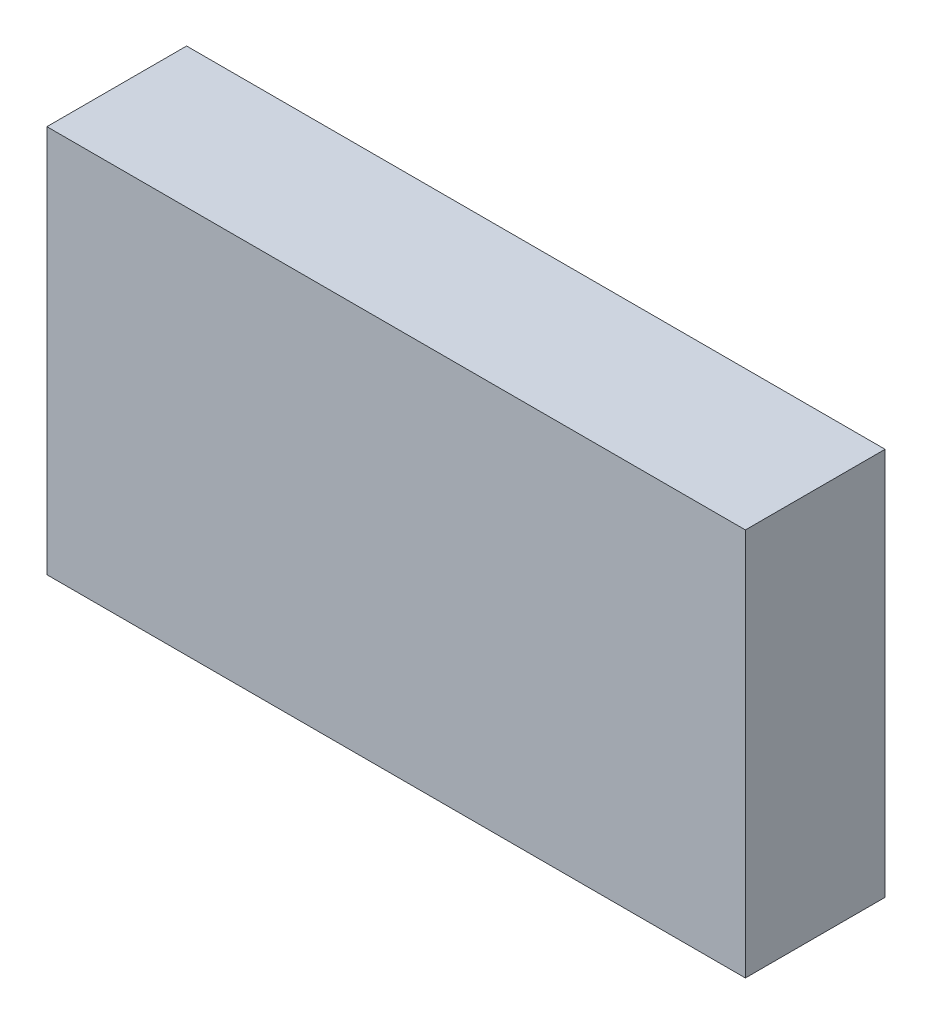
ISO-10303-21;
HEADER;
FILE_DESCRIPTION(('STEP AP214'),'2;1');
FILE_NAME('part.step','',(''),(''),'','','');
FILE_SCHEMA(('AUTOMOTIVE_DESIGN { 1 0 10303 214 1 1 1 1 }'));
ENDSEC;
DATA;
#1=APPLICATION_CONTEXT('core data for automotive mechanical design processes');
#2=APPLICATION_PROTOCOL_DEFINITION('international standard','automotive_design',2000,#1);
#3=PRODUCT_CONTEXT('',#1,'mechanical');
#4=PRODUCT('Part','Part','',(#3));
#5=PRODUCT_RELATED_PRODUCT_CATEGORY('part','',(#4));
#6=PRODUCT_DEFINITION_FORMATION('','',#4);
#7=PRODUCT_DEFINITION_CONTEXT('part definition',#1,'design');
#8=PRODUCT_DEFINITION('design','',#6,#7);
#9=PRODUCT_DEFINITION_SHAPE('','',#8);
#10=(LENGTH_UNIT() NAMED_UNIT(*) SI_UNIT(.MILLI.,.METRE.));
#11=(NAMED_UNIT(*) PLANE_ANGLE_UNIT() SI_UNIT($,.RADIAN.));
#12=(NAMED_UNIT(*) SI_UNIT($,.STERADIAN.) SOLID_ANGLE_UNIT());
#13=UNCERTAINTY_MEASURE_WITH_UNIT(LENGTH_MEASURE(1.E-05),#10,'distance_accuracy_value','');
#14=(GEOMETRIC_REPRESENTATION_CONTEXT(3) GLOBAL_UNCERTAINTY_ASSIGNED_CONTEXT((#13)) GLOBAL_UNIT_ASSIGNED_CONTEXT((#10,
#11,#12)) REPRESENTATION_CONTEXT('',''));
#15=CARTESIAN_POINT('',(0.,0.,0.));
#16=DIRECTION('',(0.,0.,1.));
#17=DIRECTION('',(1.,0.,0.));
#18=AXIS2_PLACEMENT_3D('',#15,#16,#17);
#19=CARTESIAN_POINT('',(0.,0.,18.));
#20=DIRECTION('',(1.,0.,0.));
#21=DIRECTION('',(0.,0.,-1.));
#22=AXIS2_PLACEMENT_3D('',#19,#20,#21);
#23=PLANE('',#22);
#24=DIRECTION('',(0.,-1.,0.));
#25=VECTOR('',#24,1.);
#26=CARTESIAN_POINT('',(0.,0.,0.));
#27=LINE('',#26,#25);
#28=CARTESIAN_POINT('',(0.,50.,0.));
#29=VERTEX_POINT('',#28);
#30=CARTESIAN_POINT('',(0.,0.,0.));
#31=VERTEX_POINT('',#30);
#32=EDGE_CURVE('E100',#29,#31,#27,.T.);
#33=ORIENTED_EDGE('',*,*,#32,.T.);
#34=DIRECTION('',(0.,0.,-1.));
#35=VECTOR('',#34,1.);
#36=CARTESIAN_POINT('',(0.,0.,18.));
#37=LINE('',#36,#35);
#38=CARTESIAN_POINT('',(0.,0.,18.));
#39=VERTEX_POINT('',#38);
#40=EDGE_CURVE('E11',#39,#31,#37,.T.);
#41=ORIENTED_EDGE('',*,*,#40,.F.);
#42=DIRECTION('',(0.,-1.,0.));
#43=VECTOR('',#42,1.);
#44=CARTESIAN_POINT('',(0.,0.,18.));
#45=LINE('',#44,#43);
#46=CARTESIAN_POINT('',(0.,50.,18.));
#47=VERTEX_POINT('',#46);
#48=EDGE_CURVE('E88',#47,#39,#45,.T.);
#49=ORIENTED_EDGE('',*,*,#48,.F.);
#50=DIRECTION('',(0.,0.,-1.));
#51=VECTOR('',#50,1.);
#52=CARTESIAN_POINT('',(0.,50.,18.));
#53=LINE('',#52,#51);
#54=EDGE_CURVE('E96',#47,#29,#53,.T.);
#55=ORIENTED_EDGE('',*,*,#54,.T.);
#56=EDGE_LOOP('',(#33,#41,#49,#55));
#57=FACE_BOUND('',#56,.T.);
#58=ADVANCED_FACE('F37',(#57),#23,.F.);
#59=CARTESIAN_POINT('',(0.,0.,18.));
#60=DIRECTION('',(0.,1.,0.));
#61=DIRECTION('',(0.,0.,1.));
#62=AXIS2_PLACEMENT_3D('',#59,#60,#61);
#63=PLANE('',#62);
#64=DIRECTION('',(1.,0.,0.));
#65=VECTOR('',#64,1.);
#66=CARTESIAN_POINT('',(0.,0.,0.));
#67=LINE('',#66,#65);
#68=CARTESIAN_POINT('',(90.,0.,0.));
#69=VERTEX_POINT('',#68);
#70=EDGE_CURVE('E92',#31,#69,#67,.T.);
#71=ORIENTED_EDGE('',*,*,#70,.T.);
#72=DIRECTION('',(0.,0.,-1.));
#73=VECTOR('',#72,1.);
#74=CARTESIAN_POINT('',(90.,0.,18.));
#75=LINE('',#74,#73);
#76=CARTESIAN_POINT('',(90.,0.,18.));
#77=VERTEX_POINT('',#76);
#78=EDGE_CURVE('E45',#77,#69,#75,.T.);
#79=ORIENTED_EDGE('',*,*,#78,.F.);
#80=DIRECTION('',(1.,0.,0.));
#81=VECTOR('',#80,1.);
#82=CARTESIAN_POINT('',(0.,0.,18.));
#83=LINE('',#82,#81);
#84=EDGE_CURVE('E83',#39,#77,#83,.T.);
#85=ORIENTED_EDGE('',*,*,#84,.F.);
#86=ORIENTED_EDGE('',*,*,#40,.T.);
#87=EDGE_LOOP('',(#71,#79,#85,#86));
#88=FACE_BOUND('',#87,.T.);
#89=ADVANCED_FACE('F91',(#88),#63,.F.);
#90=CARTESIAN_POINT('',(90.,0.,18.));
#91=DIRECTION('',(-1.,0.,0.));
#92=DIRECTION('',(0.,0.,1.));
#93=AXIS2_PLACEMENT_3D('',#90,#91,#92);
#94=PLANE('',#93);
#95=DIRECTION('',(0.,1.,0.));
#96=VECTOR('',#95,1.);
#97=CARTESIAN_POINT('',(90.,0.,0.));
#98=LINE('',#97,#96);
#99=CARTESIAN_POINT('',(90.,50.,0.));
#100=VERTEX_POINT('',#99);
#101=EDGE_CURVE('E70',#69,#100,#98,.T.);
#102=ORIENTED_EDGE('',*,*,#101,.T.);
#103=DIRECTION('',(0.,0.,-1.));
#104=VECTOR('',#103,1.);
#105=CARTESIAN_POINT('',(90.,50.,18.));
#106=LINE('',#105,#104);
#107=CARTESIAN_POINT('',(90.,50.,18.));
#108=VERTEX_POINT('',#107);
#109=EDGE_CURVE('E93',#108,#100,#106,.T.);
#110=ORIENTED_EDGE('',*,*,#109,.F.);
#111=DIRECTION('',(0.,1.,0.));
#112=VECTOR('',#111,1.);
#113=CARTESIAN_POINT('',(90.,0.,18.));
#114=LINE('',#113,#112);
#115=EDGE_CURVE('E86',#77,#108,#114,.T.);
#116=ORIENTED_EDGE('',*,*,#115,.F.);
#117=ORIENTED_EDGE('',*,*,#78,.T.);
#118=EDGE_LOOP('',(#102,#110,#116,#117));
#119=FACE_BOUND('',#118,.T.);
#120=ADVANCED_FACE('F94',(#119),#94,.F.);
#121=CARTESIAN_POINT('',(0.,50.,18.));
#122=DIRECTION('',(0.,-1.,0.));
#123=DIRECTION('',(0.,0.,-1.));
#124=AXIS2_PLACEMENT_3D('',#121,#122,#123);
#125=PLANE('',#124);
#126=DIRECTION('',(-1.,0.,0.));
#127=VECTOR('',#126,1.);
#128=CARTESIAN_POINT('',(0.,50.,0.));
#129=LINE('',#128,#127);
#130=EDGE_CURVE('E76',#100,#29,#129,.T.);
#131=ORIENTED_EDGE('',*,*,#130,.T.);
#132=ORIENTED_EDGE('',*,*,#54,.F.);
#133=DIRECTION('',(-1.,0.,0.));
#134=VECTOR('',#133,1.);
#135=CARTESIAN_POINT('',(0.,50.,18.));
#136=LINE('',#135,#134);
#137=EDGE_CURVE('E53',#108,#47,#136,.T.);
#138=ORIENTED_EDGE('',*,*,#137,.F.);
#139=ORIENTED_EDGE('',*,*,#109,.T.);
#140=EDGE_LOOP('',(#131,#132,#138,#139));
#141=FACE_BOUND('',#140,.T.);
#142=ADVANCED_FACE('F107',(#141),#125,.F.);
#143=CARTESIAN_POINT('',(0.,0.,18.));
#144=DIRECTION('',(0.,0.,-1.));
#145=DIRECTION('',(-1.,0.,0.));
#146=AXIS2_PLACEMENT_3D('',#143,#144,#145);
#147=PLANE('',#146);
#148=ORIENTED_EDGE('',*,*,#48,.T.);
#149=ORIENTED_EDGE('',*,*,#84,.T.);
#150=ORIENTED_EDGE('',*,*,#115,.T.);
#151=ORIENTED_EDGE('',*,*,#137,.T.);
#152=EDGE_LOOP('',(#148,#149,#150,#151));
#153=FACE_BOUND('',#152,.T.);
#154=ADVANCED_FACE('F84',(#153),#147,.F.);
#155=CARTESIAN_POINT('',(0.,0.,0.));
#156=DIRECTION('',(0.,0.,-1.));
#157=DIRECTION('',(-1.,0.,0.));
#158=AXIS2_PLACEMENT_3D('',#155,#156,#157);
#159=PLANE('',#158);
#160=ORIENTED_EDGE('',*,*,#32,.F.);
#161=ORIENTED_EDGE('',*,*,#130,.F.);
#162=ORIENTED_EDGE('',*,*,#101,.F.);
#163=ORIENTED_EDGE('',*,*,#70,.F.);
#164=EDGE_LOOP('',(#160,#161,#162,#163));
#165=FACE_BOUND('',#164,.T.);
#166=ADVANCED_FACE('F110',(#165),#159,.T.);
#167=CLOSED_SHELL('',(#58,#89,#120,#142,#154,#166));
#168=MANIFOLD_SOLID_BREP('B2',#167);
#169=ADVANCED_BREP_SHAPE_REPRESENTATION('',(#18,#168),#14);
#170=SHAPE_DEFINITION_REPRESENTATION(#9,#169);
ENDSEC;
END-ISO-10303-21;
